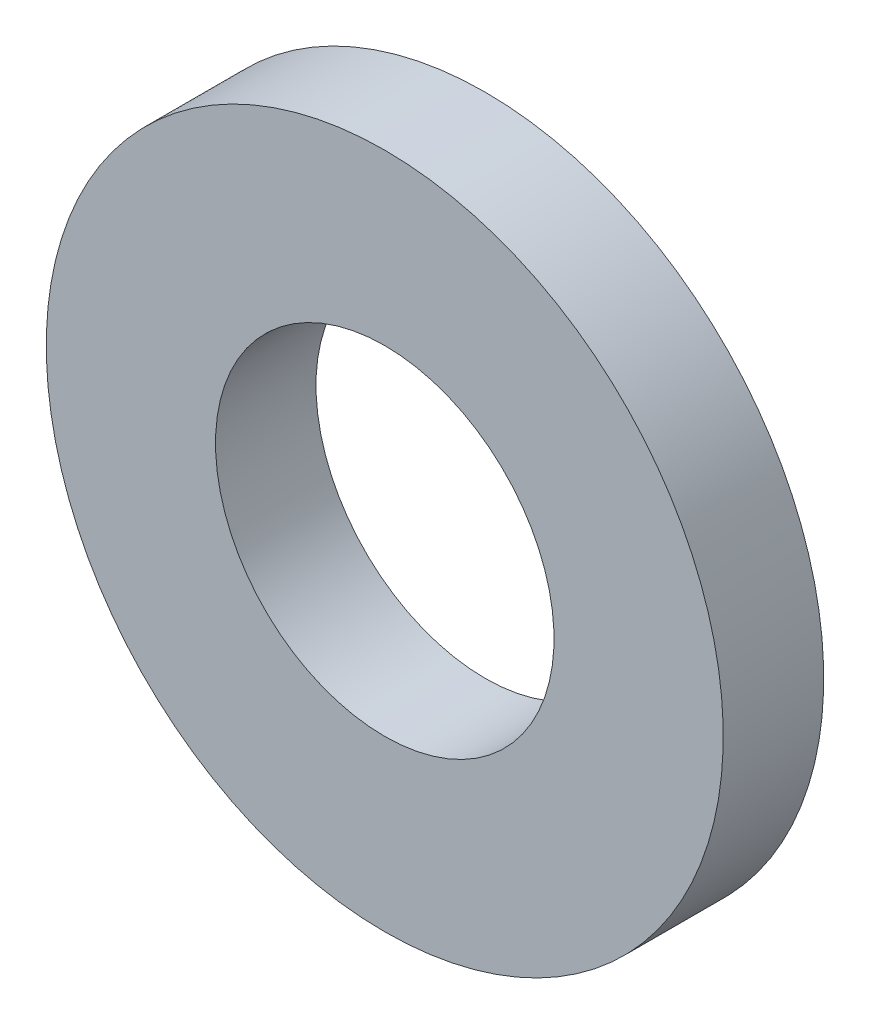
ISO-10303-21;
HEADER;
FILE_DESCRIPTION(('STEP AP214'),'2;1');
FILE_NAME('part.step','',(''),(''),'','','');
FILE_SCHEMA(('AUTOMOTIVE_DESIGN { 1 0 10303 214 1 1 1 1 }'));
ENDSEC;
DATA;
#1=APPLICATION_CONTEXT('core data for automotive mechanical design processes');
#2=APPLICATION_PROTOCOL_DEFINITION('international standard','automotive_design',2000,#1);
#3=PRODUCT_CONTEXT('',#1,'mechanical');
#4=PRODUCT('Part','Part','',(#3));
#5=PRODUCT_RELATED_PRODUCT_CATEGORY('part','',(#4));
#6=PRODUCT_DEFINITION_FORMATION('','',#4);
#7=PRODUCT_DEFINITION_CONTEXT('part definition',#1,'design');
#8=PRODUCT_DEFINITION('design','',#6,#7);
#9=PRODUCT_DEFINITION_SHAPE('','',#8);
#10=(LENGTH_UNIT() NAMED_UNIT(*) SI_UNIT(.MILLI.,.METRE.));
#11=(NAMED_UNIT(*) PLANE_ANGLE_UNIT() SI_UNIT($,.RADIAN.));
#12=(NAMED_UNIT(*) SI_UNIT($,.STERADIAN.) SOLID_ANGLE_UNIT());
#13=UNCERTAINTY_MEASURE_WITH_UNIT(LENGTH_MEASURE(1.E-05),#10,'distance_accuracy_value','');
#14=(GEOMETRIC_REPRESENTATION_CONTEXT(3) GLOBAL_UNCERTAINTY_ASSIGNED_CONTEXT((#13)) GLOBAL_UNIT_ASSIGNED_CONTEXT((#10,
#11,#12)) REPRESENTATION_CONTEXT('',''));
#15=CARTESIAN_POINT('',(0.,0.,0.));
#16=DIRECTION('',(0.,0.,1.));
#17=DIRECTION('',(1.,0.,0.));
#18=AXIS2_PLACEMENT_3D('',#15,#16,#17);
#19=CARTESIAN_POINT('',(0.,5.5626,1.651));
#20=DIRECTION('',(0.,0.,1.));
#21=DIRECTION('',(0.,-1.,0.));
#22=AXIS2_PLACEMENT_3D('',#19,#20,#21);
#23=PLANE('',#22);
#24=CARTESIAN_POINT('',(0.,0.,1.651));
#25=DIRECTION('',(0.,0.,-1.));
#26=DIRECTION('',(0.,1.,0.));
#27=AXIS2_PLACEMENT_3D('',#24,#25,#26);
#28=CIRCLE('',#27,2.7813);
#29=CARTESIAN_POINT('',(0.,2.7813,1.651));
#30=VERTEX_POINT('',#29);
#31=EDGE_CURVE('E10',#30,#30,#28,.T.);
#32=ORIENTED_EDGE('',*,*,#31,.T.);
#33=EDGE_LOOP('',(#32));
#34=FACE_BOUND('',#33,.T.);
#35=CARTESIAN_POINT('',(0.,0.,1.651));
#36=DIRECTION('',(0.,0.,-1.));
#37=DIRECTION('',(0.,1.,0.));
#38=AXIS2_PLACEMENT_3D('',#35,#36,#37);
#39=CIRCLE('',#38,5.5626);
#40=CARTESIAN_POINT('',(0.,5.5626,1.651));
#41=VERTEX_POINT('',#40);
#42=EDGE_CURVE('E44',#41,#41,#39,.T.);
#43=ORIENTED_EDGE('',*,*,#42,.F.);
#44=EDGE_LOOP('',(#43));
#45=FACE_BOUND('',#44,.T.);
#46=ADVANCED_FACE('F30',(#34,#45),#23,.T.);
#47=CARTESIAN_POINT('',(0.,0.,1.651));
#48=DIRECTION('',(0.,0.,-1.));
#49=DIRECTION('',(0.,1.,0.));
#50=AXIS2_PLACEMENT_3D('',#47,#48,#49);
#51=CYLINDRICAL_SURFACE('',#50,2.7813);
#52=CARTESIAN_POINT('',(0.,0.,0.));
#53=DIRECTION('',(0.,0.,-1.));
#54=DIRECTION('',(0.,1.,0.));
#55=AXIS2_PLACEMENT_3D('',#52,#53,#54);
#56=CIRCLE('',#55,2.7813);
#57=CARTESIAN_POINT('',(0.,2.7813,0.));
#58=VERTEX_POINT('',#57);
#59=EDGE_CURVE('E36',#58,#58,#56,.T.);
#60=ORIENTED_EDGE('',*,*,#59,.T.);
#61=EDGE_LOOP('',(#60));
#62=FACE_BOUND('',#61,.T.);
#63=ORIENTED_EDGE('',*,*,#31,.F.);
#64=EDGE_LOOP('',(#63));
#65=FACE_BOUND('',#64,.T.);
#66=ADVANCED_FACE('F54',(#62,#65),#51,.F.);
#67=CARTESIAN_POINT('',(0.,5.5626,0.));
#68=DIRECTION('',(0.,0.,-1.));
#69=DIRECTION('',(0.,1.,0.));
#70=AXIS2_PLACEMENT_3D('',#67,#68,#69);
#71=PLANE('',#70);
#72=CARTESIAN_POINT('',(0.,0.,0.));
#73=DIRECTION('',(0.,0.,-1.));
#74=DIRECTION('',(0.,1.,0.));
#75=AXIS2_PLACEMENT_3D('',#72,#73,#74);
#76=CIRCLE('',#75,5.5626);
#77=CARTESIAN_POINT('',(0.,5.5626,0.));
#78=VERTEX_POINT('',#77);
#79=EDGE_CURVE('E40',#78,#78,#76,.T.);
#80=ORIENTED_EDGE('',*,*,#79,.T.);
#81=EDGE_LOOP('',(#80));
#82=FACE_BOUND('',#81,.T.);
#83=ORIENTED_EDGE('',*,*,#59,.F.);
#84=EDGE_LOOP('',(#83));
#85=FACE_BOUND('',#84,.T.);
#86=ADVANCED_FACE('F58',(#82,#85),#71,.T.);
#87=CARTESIAN_POINT('',(0.,0.,1.651));
#88=DIRECTION('',(0.,0.,-1.));
#89=DIRECTION('',(0.,1.,0.));
#90=AXIS2_PLACEMENT_3D('',#87,#88,#89);
#91=CYLINDRICAL_SURFACE('',#90,5.5626);
#92=ORIENTED_EDGE('',*,*,#42,.T.);
#93=EDGE_LOOP('',(#92));
#94=FACE_BOUND('',#93,.T.);
#95=ORIENTED_EDGE('',*,*,#79,.F.);
#96=EDGE_LOOP('',(#95));
#97=FACE_BOUND('',#96,.T.);
#98=ADVANCED_FACE('F50',(#94,#97),#91,.T.);
#99=CLOSED_SHELL('',(#46,#66,#86,#98));
#100=MANIFOLD_SOLID_BREP('B2',#99);
#101=ADVANCED_BREP_SHAPE_REPRESENTATION('',(#18,#100),#14);
#102=SHAPE_DEFINITION_REPRESENTATION(#9,#101);
ENDSEC;
END-ISO-10303-21;
